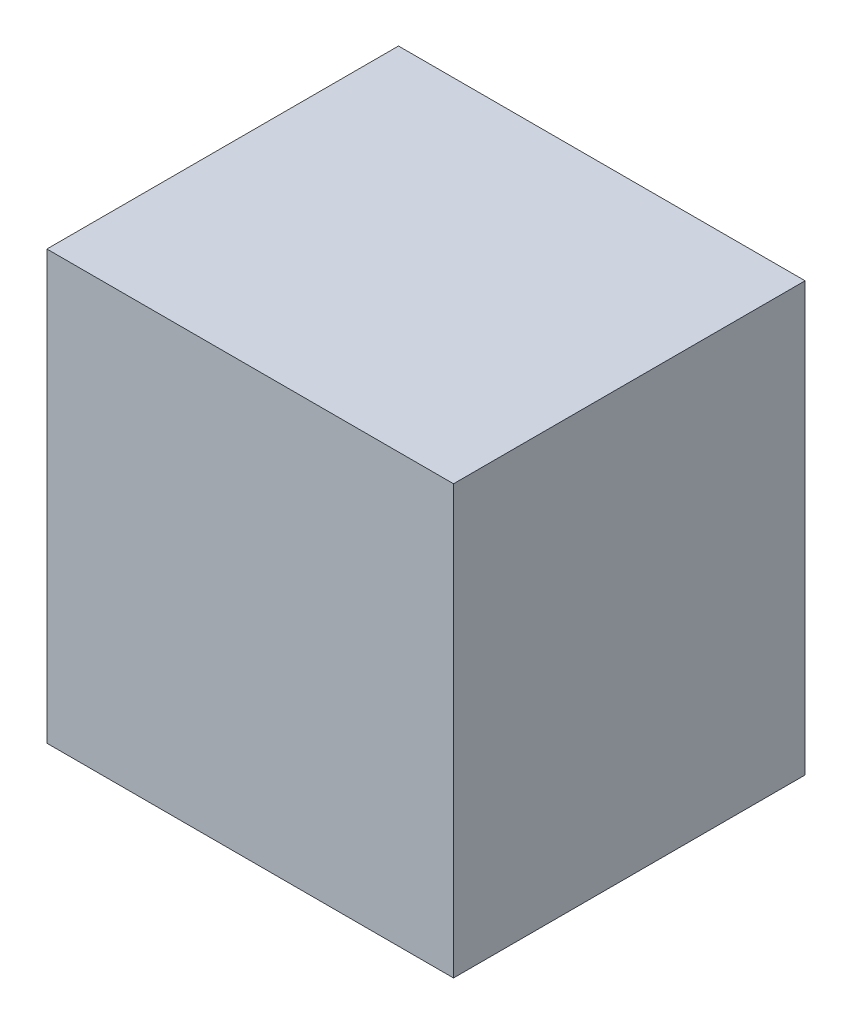
ISO-10303-21;
HEADER;
FILE_DESCRIPTION(('STEP AP214'),'2;1');
FILE_NAME('part.step','',(''),(''),'','','');
FILE_SCHEMA(('AUTOMOTIVE_DESIGN { 1 0 10303 214 1 1 1 1 }'));
ENDSEC;
DATA;
#1=APPLICATION_CONTEXT('core data for automotive mechanical design processes');
#2=APPLICATION_PROTOCOL_DEFINITION('international standard','automotive_design',2000,#1);
#3=PRODUCT_CONTEXT('',#1,'mechanical');
#4=PRODUCT('Part','Part','',(#3));
#5=PRODUCT_RELATED_PRODUCT_CATEGORY('part','',(#4));
#6=PRODUCT_DEFINITION_FORMATION('','',#4);
#7=PRODUCT_DEFINITION_CONTEXT('part definition',#1,'design');
#8=PRODUCT_DEFINITION('design','',#6,#7);
#9=PRODUCT_DEFINITION_SHAPE('','',#8);
#10=(LENGTH_UNIT() NAMED_UNIT(*) SI_UNIT(.MILLI.,.METRE.));
#11=(NAMED_UNIT(*) PLANE_ANGLE_UNIT() SI_UNIT($,.RADIAN.));
#12=(NAMED_UNIT(*) SI_UNIT($,.STERADIAN.) SOLID_ANGLE_UNIT());
#13=UNCERTAINTY_MEASURE_WITH_UNIT(LENGTH_MEASURE(1.E-05),#10,'distance_accuracy_value','');
#14=(GEOMETRIC_REPRESENTATION_CONTEXT(3) GLOBAL_UNCERTAINTY_ASSIGNED_CONTEXT((#13)) GLOBAL_UNIT_ASSIGNED_CONTEXT((#10,
#11,#12)) REPRESENTATION_CONTEXT('',''));
#15=CARTESIAN_POINT('',(0.,0.,0.));
#16=DIRECTION('',(0.,0.,1.));
#17=DIRECTION('',(1.,0.,0.));
#18=AXIS2_PLACEMENT_3D('',#15,#16,#17);
#19=CARTESIAN_POINT('',(13.3,28.,11.5));
#20=DIRECTION('',(-1.,0.,0.));
#21=DIRECTION('',(0.,0.,1.));
#22=AXIS2_PLACEMENT_3D('',#19,#20,#21);
#23=PLANE('',#22);
#24=DIRECTION('',(0.,0.,-1.));
#25=VECTOR('',#24,1.);
#26=CARTESIAN_POINT('',(13.3,0.,11.5));
#27=LINE('',#26,#25);
#28=CARTESIAN_POINT('',(13.3,0.,11.5));
#29=VERTEX_POINT('',#28);
#30=CARTESIAN_POINT('',(13.3,0.,-11.5));
#31=VERTEX_POINT('',#30);
#32=EDGE_CURVE('E113',#29,#31,#27,.T.);
#33=ORIENTED_EDGE('',*,*,#32,.T.);
#34=DIRECTION('',(0.,-1.,0.));
#35=VECTOR('',#34,1.);
#36=CARTESIAN_POINT('',(13.3,28.,-11.5));
#37=LINE('',#36,#35);
#38=CARTESIAN_POINT('',(13.3,28.,-11.5));
#39=VERTEX_POINT('',#38);
#40=EDGE_CURVE('E11',#39,#31,#37,.T.);
#41=ORIENTED_EDGE('',*,*,#40,.F.);
#42=DIRECTION('',(0.,0.,-1.));
#43=VECTOR('',#42,1.);
#44=CARTESIAN_POINT('',(13.3,28.,11.5));
#45=LINE('',#44,#43);
#46=CARTESIAN_POINT('',(13.3,28.,11.5));
#47=VERTEX_POINT('',#46);
#48=EDGE_CURVE('E97',#47,#39,#45,.T.);
#49=ORIENTED_EDGE('',*,*,#48,.F.);
#50=DIRECTION('',(0.,-1.,0.));
#51=VECTOR('',#50,1.);
#52=CARTESIAN_POINT('',(13.3,28.,11.5));
#53=LINE('',#52,#51);
#54=EDGE_CURVE('E109',#47,#29,#53,.T.);
#55=ORIENTED_EDGE('',*,*,#54,.T.);
#56=EDGE_LOOP('',(#33,#41,#49,#55));
#57=FACE_BOUND('',#56,.T.);
#58=ADVANCED_FACE('F45',(#57),#23,.F.);
#59=CARTESIAN_POINT('',(-13.3,28.,-11.5));
#60=DIRECTION('',(0.,0.,1.));
#61=DIRECTION('',(1.,0.,0.));
#62=AXIS2_PLACEMENT_3D('',#59,#60,#61);
#63=PLANE('',#62);
#64=DIRECTION('',(-1.,0.,0.));
#65=VECTOR('',#64,1.);
#66=CARTESIAN_POINT('',(-13.3,0.,-11.5));
#67=LINE('',#66,#65);
#68=CARTESIAN_POINT('',(-13.3,0.,-11.5));
#69=VERTEX_POINT('',#68);
#70=EDGE_CURVE('E102',#31,#69,#67,.T.);
#71=ORIENTED_EDGE('',*,*,#70,.T.);
#72=DIRECTION('',(0.,-1.,0.));
#73=VECTOR('',#72,1.);
#74=CARTESIAN_POINT('',(-13.3,28.,-11.5));
#75=LINE('',#74,#73);
#76=CARTESIAN_POINT('',(-13.3,28.,-11.5));
#77=VERTEX_POINT('',#76);
#78=EDGE_CURVE('E54',#77,#69,#75,.T.);
#79=ORIENTED_EDGE('',*,*,#78,.F.);
#80=DIRECTION('',(-1.,0.,0.));
#81=VECTOR('',#80,1.);
#82=CARTESIAN_POINT('',(-13.3,28.,-11.5));
#83=LINE('',#82,#81);
#84=EDGE_CURVE('E92',#39,#77,#83,.T.);
#85=ORIENTED_EDGE('',*,*,#84,.F.);
#86=ORIENTED_EDGE('',*,*,#40,.T.);
#87=EDGE_LOOP('',(#71,#79,#85,#86));
#88=FACE_BOUND('',#87,.T.);
#89=ADVANCED_FACE('F101',(#88),#63,.F.);
#90=CARTESIAN_POINT('',(-13.3,28.,11.5));
#91=DIRECTION('',(1.,0.,0.));
#92=DIRECTION('',(0.,0.,-1.));
#93=AXIS2_PLACEMENT_3D('',#90,#91,#92);
#94=PLANE('',#93);
#95=DIRECTION('',(0.,0.,1.));
#96=VECTOR('',#95,1.);
#97=CARTESIAN_POINT('',(-13.3,0.,11.5));
#98=LINE('',#97,#96);
#99=CARTESIAN_POINT('',(-13.3,0.,11.5));
#100=VERTEX_POINT('',#99);
#101=EDGE_CURVE('E79',#69,#100,#98,.T.);
#102=ORIENTED_EDGE('',*,*,#101,.T.);
#103=DIRECTION('',(0.,-1.,0.));
#104=VECTOR('',#103,1.);
#105=CARTESIAN_POINT('',(-13.3,28.,11.5));
#106=LINE('',#105,#104);
#107=CARTESIAN_POINT('',(-13.3,28.,11.5));
#108=VERTEX_POINT('',#107);
#109=EDGE_CURVE('E104',#108,#100,#106,.T.);
#110=ORIENTED_EDGE('',*,*,#109,.F.);
#111=DIRECTION('',(0.,0.,1.));
#112=VECTOR('',#111,1.);
#113=CARTESIAN_POINT('',(-13.3,28.,11.5));
#114=LINE('',#113,#112);
#115=EDGE_CURVE('E95',#77,#108,#114,.T.);
#116=ORIENTED_EDGE('',*,*,#115,.F.);
#117=ORIENTED_EDGE('',*,*,#78,.T.);
#118=EDGE_LOOP('',(#102,#110,#116,#117));
#119=FACE_BOUND('',#118,.T.);
#120=ADVANCED_FACE('F105',(#119),#94,.F.);
#121=CARTESIAN_POINT('',(-13.3,28.,11.5));
#122=DIRECTION('',(0.,0.,-1.));
#123=DIRECTION('',(-1.,0.,0.));
#124=AXIS2_PLACEMENT_3D('',#121,#122,#123);
#125=PLANE('',#124);
#126=DIRECTION('',(1.,0.,0.));
#127=VECTOR('',#126,1.);
#128=CARTESIAN_POINT('',(-13.3,0.,11.5));
#129=LINE('',#128,#127);
#130=EDGE_CURVE('E85',#100,#29,#129,.T.);
#131=ORIENTED_EDGE('',*,*,#130,.T.);
#132=ORIENTED_EDGE('',*,*,#54,.F.);
#133=DIRECTION('',(1.,0.,0.));
#134=VECTOR('',#133,1.);
#135=CARTESIAN_POINT('',(-13.3,28.,11.5));
#136=LINE('',#135,#134);
#137=EDGE_CURVE('E62',#108,#47,#136,.T.);
#138=ORIENTED_EDGE('',*,*,#137,.F.);
#139=ORIENTED_EDGE('',*,*,#109,.T.);
#140=EDGE_LOOP('',(#131,#132,#138,#139));
#141=FACE_BOUND('',#140,.T.);
#142=ADVANCED_FACE('F126',(#141),#125,.F.);
#143=CARTESIAN_POINT('',(0.,28.,0.));
#144=DIRECTION('',(0.,-1.,0.));
#145=DIRECTION('',(0.,0.,-1.));
#146=AXIS2_PLACEMENT_3D('',#143,#144,#145);
#147=PLANE('',#146);
#148=ORIENTED_EDGE('',*,*,#48,.T.);
#149=ORIENTED_EDGE('',*,*,#84,.T.);
#150=ORIENTED_EDGE('',*,*,#115,.T.);
#151=ORIENTED_EDGE('',*,*,#137,.T.);
#152=EDGE_LOOP('',(#148,#149,#150,#151));
#153=FACE_BOUND('',#152,.T.);
#154=ADVANCED_FACE('F93',(#153),#147,.F.);
#155=CARTESIAN_POINT('',(0.,0.,0.));
#156=DIRECTION('',(0.,-1.,0.));
#157=DIRECTION('',(0.,0.,-1.));
#158=AXIS2_PLACEMENT_3D('',#155,#156,#157);
#159=PLANE('',#158);
#160=ORIENTED_EDGE('',*,*,#32,.F.);
#161=ORIENTED_EDGE('',*,*,#130,.F.);
#162=ORIENTED_EDGE('',*,*,#101,.F.);
#163=ORIENTED_EDGE('',*,*,#70,.F.);
#164=EDGE_LOOP('',(#160,#161,#162,#163));
#165=FACE_BOUND('',#164,.T.);
#166=ADVANCED_FACE('F129',(#165),#159,.T.);
#167=CLOSED_SHELL('',(#58,#89,#120,#142,#154,#166));
#168=MANIFOLD_SOLID_BREP('B2',#167);
#169=ADVANCED_BREP_SHAPE_REPRESENTATION('',(#18,#168),#14);
#170=SHAPE_DEFINITION_REPRESENTATION(#9,#169);
ENDSEC;
END-ISO-10303-21;
